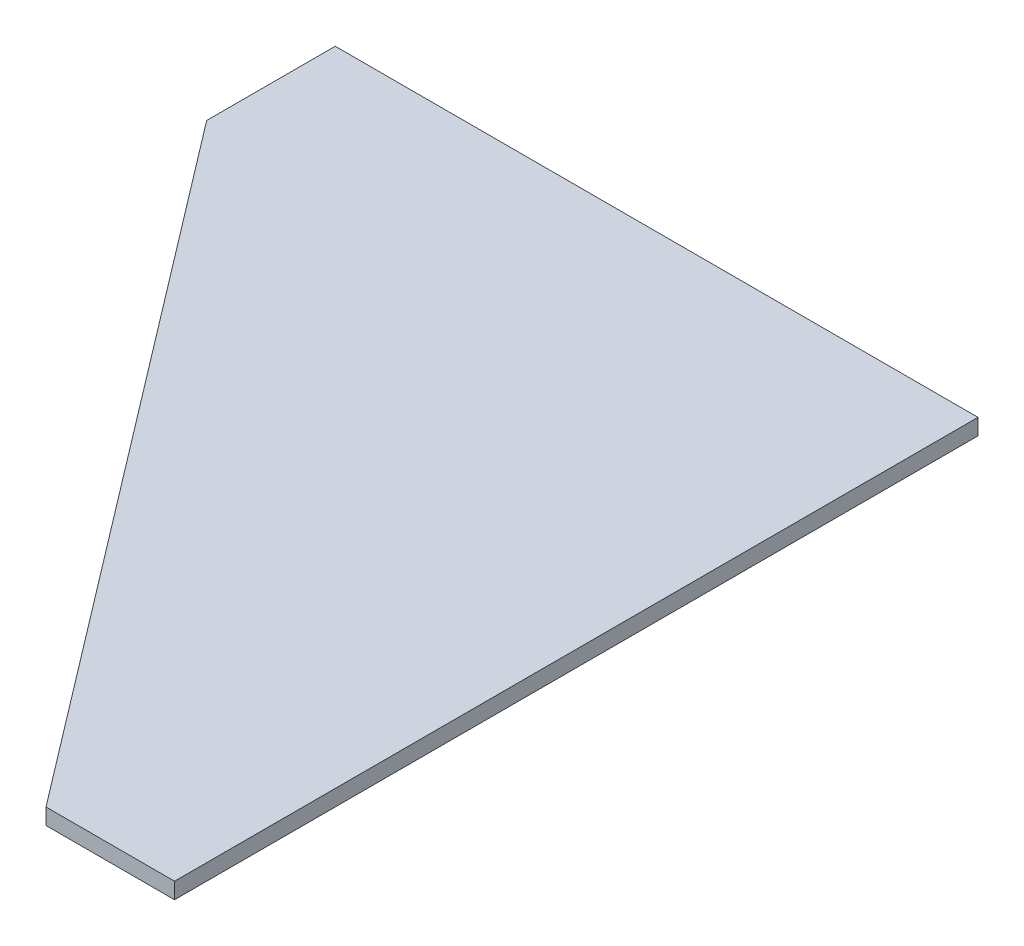
ISO-10303-21;
HEADER;
FILE_DESCRIPTION(('STEP AP214'),'2;1');
FILE_NAME('part.step','',(''),(''),'','','');
FILE_SCHEMA(('AUTOMOTIVE_DESIGN { 1 0 10303 214 1 1 1 1 }'));
ENDSEC;
DATA;
#1=APPLICATION_CONTEXT('core data for automotive mechanical design processes');
#2=APPLICATION_PROTOCOL_DEFINITION('international standard','automotive_design',2000,#1);
#3=PRODUCT_CONTEXT('',#1,'mechanical');
#4=PRODUCT('Part','Part','',(#3));
#5=PRODUCT_RELATED_PRODUCT_CATEGORY('part','',(#4));
#6=PRODUCT_DEFINITION_FORMATION('','',#4);
#7=PRODUCT_DEFINITION_CONTEXT('part definition',#1,'design');
#8=PRODUCT_DEFINITION('design','',#6,#7);
#9=PRODUCT_DEFINITION_SHAPE('','',#8);
#10=(LENGTH_UNIT() NAMED_UNIT(*) SI_UNIT(.MILLI.,.METRE.));
#11=(NAMED_UNIT(*) PLANE_ANGLE_UNIT() SI_UNIT($,.RADIAN.));
#12=(NAMED_UNIT(*) SI_UNIT($,.STERADIAN.) SOLID_ANGLE_UNIT());
#13=UNCERTAINTY_MEASURE_WITH_UNIT(LENGTH_MEASURE(1.E-05),#10,'distance_accuracy_value','');
#14=(GEOMETRIC_REPRESENTATION_CONTEXT(3) GLOBAL_UNCERTAINTY_ASSIGNED_CONTEXT((#13)) GLOBAL_UNIT_ASSIGNED_CONTEXT((#10,
#11,#12)) REPRESENTATION_CONTEXT('',''));
#15=CARTESIAN_POINT('',(0.,0.,0.));
#16=DIRECTION('',(0.,0.,1.));
#17=DIRECTION('',(1.,0.,0.));
#18=AXIS2_PLACEMENT_3D('',#15,#16,#17);
#19=CARTESIAN_POINT('',(-46.2994261119082,3.175,35.2757532281205));
#20=DIRECTION('',(0.795431720032499,0.,-0.606043215262856));
#21=DIRECTION('',(-0.606043215262856,0.,-0.795431720032499));
#22=AXIS2_PLACEMENT_3D('',#19,#20,#21);
#23=PLANE('',#22);
#24=DIRECTION('',(0.606043215262856,0.,0.795431720032499));
#25=VECTOR('',#24,1.);
#26=CARTESIAN_POINT('',(-46.2994261119082,0.,35.2757532281205));
#27=LINE('',#26,#25);
#28=CARTESIAN_POINT('',(-114.3,0.,-53.975));
#29=VERTEX_POINT('',#28);
#30=CARTESIAN_POINT('',(-12.7,0.,79.375));
#31=VERTEX_POINT('',#30);
#32=EDGE_CURVE('E116',#29,#31,#27,.T.);
#33=ORIENTED_EDGE('',*,*,#32,.T.);
#34=DIRECTION('',(0.,-1.,0.));
#35=VECTOR('',#34,1.);
#36=CARTESIAN_POINT('',(-12.7,3.175,79.375));
#37=LINE('',#36,#35);
#38=CARTESIAN_POINT('',(-12.7,3.175,79.375));
#39=VERTEX_POINT('',#38);
#40=EDGE_CURVE('E11',#39,#31,#37,.T.);
#41=ORIENTED_EDGE('',*,*,#40,.F.);
#42=DIRECTION('',(0.606043215262856,0.,0.795431720032499));
#43=VECTOR('',#42,1.);
#44=CARTESIAN_POINT('',(-46.2994261119082,3.175,35.2757532281205));
#45=LINE('',#44,#43);
#46=CARTESIAN_POINT('',(-114.3,3.175,-53.975));
#47=VERTEX_POINT('',#46);
#48=EDGE_CURVE('E109',#47,#39,#45,.T.);
#49=ORIENTED_EDGE('',*,*,#48,.F.);
#50=DIRECTION('',(0.,-1.,0.));
#51=VECTOR('',#50,1.);
#52=CARTESIAN_POINT('',(-114.3,3.175,-53.975));
#53=LINE('',#52,#51);
#54=EDGE_CURVE('E112',#47,#29,#53,.T.);
#55=ORIENTED_EDGE('',*,*,#54,.T.);
#56=EDGE_LOOP('',(#33,#41,#49,#55));
#57=FACE_BOUND('',#56,.T.);
#58=ADVANCED_FACE('F41',(#57),#23,.F.);
#59=CARTESIAN_POINT('',(0.,3.175,79.375));
#60=DIRECTION('',(0.,0.,-1.));
#61=DIRECTION('',(-1.,0.,0.));
#62=AXIS2_PLACEMENT_3D('',#59,#60,#61);
#63=PLANE('',#62);
#64=DIRECTION('',(1.,0.,0.));
#65=VECTOR('',#64,1.);
#66=CARTESIAN_POINT('',(0.,0.,79.375));
#67=LINE('',#66,#65);
#68=CARTESIAN_POINT('',(12.7,0.,79.375));
#69=VERTEX_POINT('',#68);
#70=EDGE_CURVE('E117',#31,#69,#67,.T.);
#71=ORIENTED_EDGE('',*,*,#70,.T.);
#72=DIRECTION('',(0.,-1.,0.));
#73=VECTOR('',#72,1.);
#74=CARTESIAN_POINT('',(12.7,3.175,79.375));
#75=LINE('',#74,#73);
#76=CARTESIAN_POINT('',(12.7,3.175,79.375));
#77=VERTEX_POINT('',#76);
#78=EDGE_CURVE('E47',#77,#69,#75,.T.);
#79=ORIENTED_EDGE('',*,*,#78,.F.);
#80=DIRECTION('',(1.,0.,0.));
#81=VECTOR('',#80,1.);
#82=CARTESIAN_POINT('',(0.,3.175,79.375));
#83=LINE('',#82,#81);
#84=EDGE_CURVE('E87',#39,#77,#83,.T.);
#85=ORIENTED_EDGE('',*,*,#84,.F.);
#86=ORIENTED_EDGE('',*,*,#40,.T.);
#87=EDGE_LOOP('',(#71,#79,#85,#86));
#88=FACE_BOUND('',#87,.T.);
#89=ADVANCED_FACE('F126',(#88),#63,.F.);
#90=CARTESIAN_POINT('',(12.7,3.175,0.));
#91=DIRECTION('',(1.,0.,0.));
#92=DIRECTION('',(0.,0.,-1.));
#93=AXIS2_PLACEMENT_3D('',#90,#91,#92);
#94=PLANE('',#93);
#95=DIRECTION('',(0.,0.,1.));
#96=VECTOR('',#95,1.);
#97=CARTESIAN_POINT('',(12.7,0.,0.));
#98=LINE('',#97,#96);
#99=CARTESIAN_POINT('',(12.7,0.,-79.375));
#100=VERTEX_POINT('',#99);
#101=EDGE_CURVE('E105',#100,#69,#98,.T.);
#102=ORIENTED_EDGE('',*,*,#101,.F.);
#103=DIRECTION('',(0.,-1.,0.));
#104=VECTOR('',#103,1.);
#105=CARTESIAN_POINT('',(12.7,3.175,-79.375));
#106=LINE('',#105,#104);
#107=CARTESIAN_POINT('',(12.7,3.175,-79.375));
#108=VERTEX_POINT('',#107);
#109=EDGE_CURVE('E96',#108,#100,#106,.T.);
#110=ORIENTED_EDGE('',*,*,#109,.F.);
#111=DIRECTION('',(0.,0.,1.));
#112=VECTOR('',#111,1.);
#113=CARTESIAN_POINT('',(12.7,3.175,0.));
#114=LINE('',#113,#112);
#115=EDGE_CURVE('E99',#108,#77,#114,.T.);
#116=ORIENTED_EDGE('',*,*,#115,.T.);
#117=ORIENTED_EDGE('',*,*,#78,.T.);
#118=EDGE_LOOP('',(#102,#110,#116,#117));
#119=FACE_BOUND('',#118,.T.);
#120=ADVANCED_FACE('F97',(#119),#94,.T.);
#121=CARTESIAN_POINT('',(0.,3.175,-79.375));
#122=DIRECTION('',(0.,0.,1.));
#123=DIRECTION('',(1.,0.,0.));
#124=AXIS2_PLACEMENT_3D('',#121,#122,#123);
#125=PLANE('',#124);
#126=DIRECTION('',(-1.,0.,0.));
#127=VECTOR('',#126,1.);
#128=CARTESIAN_POINT('',(0.,0.,-79.375));
#129=LINE('',#128,#127);
#130=CARTESIAN_POINT('',(-114.3,0.,-79.375));
#131=VERTEX_POINT('',#130);
#132=EDGE_CURVE('E77',#100,#131,#129,.T.);
#133=ORIENTED_EDGE('',*,*,#132,.T.);
#134=DIRECTION('',(0.,-1.,0.));
#135=VECTOR('',#134,1.);
#136=CARTESIAN_POINT('',(-114.3,3.175,-79.375));
#137=LINE('',#136,#135);
#138=CARTESIAN_POINT('',(-114.3,3.175,-79.375));
#139=VERTEX_POINT('',#138);
#140=EDGE_CURVE('E101',#139,#131,#137,.T.);
#141=ORIENTED_EDGE('',*,*,#140,.F.);
#142=DIRECTION('',(-1.,0.,0.));
#143=VECTOR('',#142,1.);
#144=CARTESIAN_POINT('',(0.,3.175,-79.375));
#145=LINE('',#144,#143);
#146=EDGE_CURVE('E102',#108,#139,#145,.T.);
#147=ORIENTED_EDGE('',*,*,#146,.F.);
#148=ORIENTED_EDGE('',*,*,#109,.T.);
#149=EDGE_LOOP('',(#133,#141,#147,#148));
#150=FACE_BOUND('',#149,.T.);
#151=ADVANCED_FACE('F108',(#150),#125,.F.);
#152=CARTESIAN_POINT('',(-114.3,3.175,0.));
#153=DIRECTION('',(1.,0.,0.));
#154=DIRECTION('',(0.,0.,-1.));
#155=AXIS2_PLACEMENT_3D('',#152,#153,#154);
#156=PLANE('',#155);
#157=DIRECTION('',(0.,0.,1.));
#158=VECTOR('',#157,1.);
#159=CARTESIAN_POINT('',(-114.3,0.,0.));
#160=LINE('',#159,#158);
#161=EDGE_CURVE('E85',#131,#29,#160,.T.);
#162=ORIENTED_EDGE('',*,*,#161,.T.);
#163=ORIENTED_EDGE('',*,*,#54,.F.);
#164=DIRECTION('',(0.,0.,1.));
#165=VECTOR('',#164,1.);
#166=CARTESIAN_POINT('',(-114.3,3.175,0.));
#167=LINE('',#166,#165);
#168=EDGE_CURVE('E60',#139,#47,#167,.T.);
#169=ORIENTED_EDGE('',*,*,#168,.F.);
#170=ORIENTED_EDGE('',*,*,#140,.T.);
#171=EDGE_LOOP('',(#162,#163,#169,#170));
#172=FACE_BOUND('',#171,.T.);
#173=ADVANCED_FACE('F134',(#172),#156,.F.);
#174=CARTESIAN_POINT('',(0.,3.175,0.));
#175=DIRECTION('',(0.,1.,0.));
#176=DIRECTION('',(0.,0.,1.));
#177=AXIS2_PLACEMENT_3D('',#174,#175,#176);
#178=PLANE('',#177);
#179=ORIENTED_EDGE('',*,*,#48,.T.);
#180=ORIENTED_EDGE('',*,*,#84,.T.);
#181=ORIENTED_EDGE('',*,*,#115,.F.);
#182=ORIENTED_EDGE('',*,*,#146,.T.);
#183=ORIENTED_EDGE('',*,*,#168,.T.);
#184=EDGE_LOOP('',(#179,#180,#181,#182,#183));
#185=FACE_BOUND('',#184,.T.);
#186=ADVANCED_FACE('F106',(#185),#178,.T.);
#187=CARTESIAN_POINT('',(0.,0.,0.));
#188=DIRECTION('',(0.,1.,0.));
#189=DIRECTION('',(0.,0.,1.));
#190=AXIS2_PLACEMENT_3D('',#187,#188,#189);
#191=PLANE('',#190);
#192=ORIENTED_EDGE('',*,*,#32,.F.);
#193=ORIENTED_EDGE('',*,*,#161,.F.);
#194=ORIENTED_EDGE('',*,*,#132,.F.);
#195=ORIENTED_EDGE('',*,*,#101,.T.);
#196=ORIENTED_EDGE('',*,*,#70,.F.);
#197=EDGE_LOOP('',(#192,#193,#194,#195,#196));
#198=FACE_BOUND('',#197,.T.);
#199=ADVANCED_FACE('F129',(#198),#191,.F.);
#200=CLOSED_SHELL('',(#58,#89,#120,#151,#173,#186,#199));
#201=MANIFOLD_SOLID_BREP('B2',#200);
#202=ADVANCED_BREP_SHAPE_REPRESENTATION('',(#18,#201),#14);
#203=SHAPE_DEFINITION_REPRESENTATION(#9,#202);
ENDSEC;
END-ISO-10303-21;
